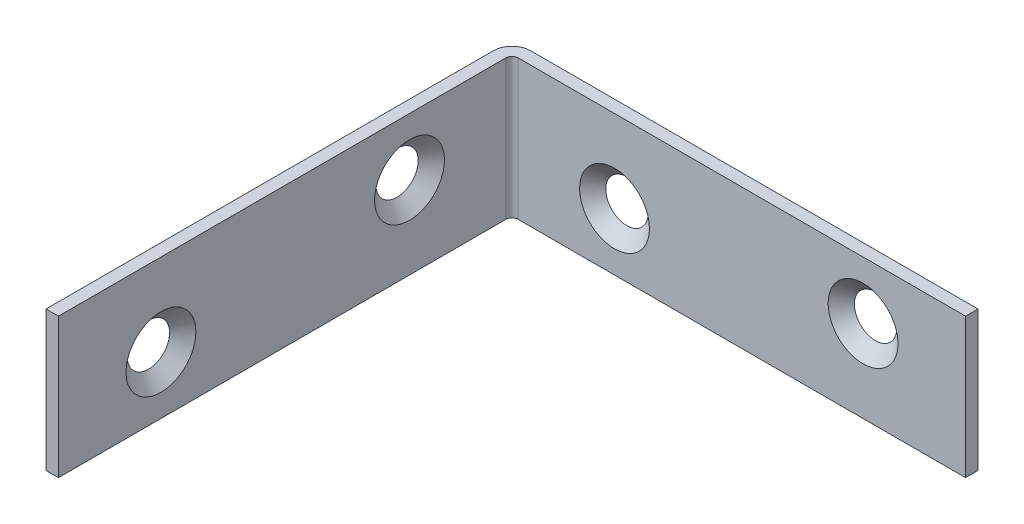
ISO-10303-21;
HEADER;
FILE_DESCRIPTION(('STEP AP214'),'2;1');
FILE_NAME('part.step','',(''),(''),'','','');
FILE_SCHEMA(('AUTOMOTIVE_DESIGN { 1 0 10303 214 1 1 1 1 }'));
ENDSEC;
DATA;
#1=APPLICATION_CONTEXT('core data for automotive mechanical design processes');
#2=APPLICATION_PROTOCOL_DEFINITION('international standard','automotive_design',2000,#1);
#3=PRODUCT_CONTEXT('',#1,'mechanical');
#4=PRODUCT('Part','Part','',(#3));
#5=PRODUCT_RELATED_PRODUCT_CATEGORY('part','',(#4));
#6=PRODUCT_DEFINITION_FORMATION('','',#4);
#7=PRODUCT_DEFINITION_CONTEXT('part definition',#1,'design');
#8=PRODUCT_DEFINITION('design','',#6,#7);
#9=PRODUCT_DEFINITION_SHAPE('','',#8);
#10=(LENGTH_UNIT() NAMED_UNIT(*) SI_UNIT(.MILLI.,.METRE.));
#11=(NAMED_UNIT(*) PLANE_ANGLE_UNIT() SI_UNIT($,.RADIAN.));
#12=(NAMED_UNIT(*) SI_UNIT($,.STERADIAN.) SOLID_ANGLE_UNIT());
#13=UNCERTAINTY_MEASURE_WITH_UNIT(LENGTH_MEASURE(1.E-05),#10,'distance_accuracy_value','');
#14=(GEOMETRIC_REPRESENTATION_CONTEXT(3) GLOBAL_UNCERTAINTY_ASSIGNED_CONTEXT((#13)) GLOBAL_UNIT_ASSIGNED_CONTEXT((#10,
#11,#12)) REPRESENTATION_CONTEXT('',''));
#15=CARTESIAN_POINT('',(0.,0.,0.));
#16=DIRECTION('',(0.,0.,1.));
#17=DIRECTION('',(1.,0.,0.));
#18=AXIS2_PLACEMENT_3D('',#15,#16,#17);
#19=CARTESIAN_POINT('',(2.4003,9.0043,1.6002));
#20=DIRECTION('',(0.,0.,-1.));
#21=DIRECTION('',(-1.,0.,0.));
#22=AXIS2_PLACEMENT_3D('',#19,#20,#21);
#23=PLANE('',#22);
#24=CARTESIAN_POINT('',(46.7975,1.5875,1.6002));
#25=DIRECTION('',(0.,0.,-1.));
#26=DIRECTION('',(-1.,0.,0.));
#27=AXIS2_PLACEMENT_3D('',#24,#25,#26);
#28=CIRCLE('',#27,4.49580000000002);
#29=CARTESIAN_POINT('',(42.3017,1.5875,1.6002));
#30=VERTEX_POINT('',#29);
#31=EDGE_CURVE('E11',#30,#30,#28,.T.);
#32=ORIENTED_EDGE('',*,*,#31,.T.);
#33=EDGE_LOOP('',(#32));
#34=FACE_BOUND('',#33,.T.);
#35=CARTESIAN_POINT('',(14.7975,-1.5875,1.6002));
#36=DIRECTION('',(0.,0.,-1.));
#37=DIRECTION('',(-1.,0.,0.));
#38=AXIS2_PLACEMENT_3D('',#35,#36,#37);
#39=CIRCLE('',#38,4.49580000000001);
#40=CARTESIAN_POINT('',(10.3017,-1.5875,1.6002));
#41=VERTEX_POINT('',#40);
#42=EDGE_CURVE('E41',#41,#41,#39,.T.);
#43=ORIENTED_EDGE('',*,*,#42,.T.);
#44=EDGE_LOOP('',(#43));
#45=FACE_BOUND('',#44,.T.);
#46=DIRECTION('',(1.,0.,0.));
#47=VECTOR('',#46,1.);
#48=CARTESIAN_POINT('',(2.4003,-9.0043,1.6002));
#49=LINE('',#48,#47);
#50=CARTESIAN_POINT('',(2.4003,-9.0043,1.6002));
#51=VERTEX_POINT('',#50);
#52=CARTESIAN_POINT('',(59.9948,-9.0043,1.6002));
#53=VERTEX_POINT('',#52);
#54=EDGE_CURVE('E131',#51,#53,#49,.T.);
#55=ORIENTED_EDGE('',*,*,#54,.T.);
#56=DIRECTION('',(0.,-1.,0.));
#57=VECTOR('',#56,1.);
#58=CARTESIAN_POINT('',(59.9948,9.0043,1.6002));
#59=LINE('',#58,#57);
#60=CARTESIAN_POINT('',(59.9948,9.0043,1.6002));
#61=VERTEX_POINT('',#60);
#62=EDGE_CURVE('E159',#61,#53,#59,.T.);
#63=ORIENTED_EDGE('',*,*,#62,.F.);
#64=DIRECTION('',(1.,0.,0.));
#65=VECTOR('',#64,1.);
#66=CARTESIAN_POINT('',(2.4003,9.0043,1.6002));
#67=LINE('',#66,#65);
#68=CARTESIAN_POINT('',(2.4003,9.0043,1.6002));
#69=VERTEX_POINT('',#68);
#70=EDGE_CURVE('E89',#69,#61,#67,.T.);
#71=ORIENTED_EDGE('',*,*,#70,.F.);
#72=DIRECTION('',(0.,-1.,0.));
#73=VECTOR('',#72,1.);
#74=CARTESIAN_POINT('',(2.4003,9.0043,1.6002));
#75=LINE('',#74,#73);
#76=EDGE_CURVE('E130',#69,#51,#75,.T.);
#77=ORIENTED_EDGE('',*,*,#76,.T.);
#78=EDGE_LOOP('',(#55,#63,#71,#77));
#79=FACE_BOUND('',#78,.T.);
#80=ADVANCED_FACE('F32',(#34,#45,#79),#23,.F.);
#81=CARTESIAN_POINT('',(59.9948,9.0043,0.));
#82=DIRECTION('',(1.,0.,0.));
#83=DIRECTION('',(0.,0.,-1.));
#84=AXIS2_PLACEMENT_3D('',#81,#82,#83);
#85=PLANE('',#84);
#86=DIRECTION('',(0.,0.,1.));
#87=VECTOR('',#86,1.);
#88=CARTESIAN_POINT('',(59.9948,-9.0043,0.));
#89=LINE('',#88,#87);
#90=CARTESIAN_POINT('',(59.9948,-9.0043,0.));
#91=VERTEX_POINT('',#90);
#92=EDGE_CURVE('E134',#91,#53,#89,.T.);
#93=ORIENTED_EDGE('',*,*,#92,.F.);
#94=DIRECTION('',(0.,-1.,0.));
#95=VECTOR('',#94,1.);
#96=CARTESIAN_POINT('',(59.9948,9.0043,0.));
#97=LINE('',#96,#95);
#98=CARTESIAN_POINT('',(59.9948,9.0043,0.));
#99=VERTEX_POINT('',#98);
#100=EDGE_CURVE('E157',#99,#91,#97,.T.);
#101=ORIENTED_EDGE('',*,*,#100,.F.);
#102=DIRECTION('',(0.,0.,1.));
#103=VECTOR('',#102,1.);
#104=CARTESIAN_POINT('',(59.9948,9.0043,0.));
#105=LINE('',#104,#103);
#106=EDGE_CURVE('E196',#99,#61,#105,.T.);
#107=ORIENTED_EDGE('',*,*,#106,.T.);
#108=ORIENTED_EDGE('',*,*,#62,.T.);
#109=EDGE_LOOP('',(#93,#101,#107,#108));
#110=FACE_BOUND('',#109,.T.);
#111=ADVANCED_FACE('F181',(#110),#85,.T.);
#112=CARTESIAN_POINT('',(2.4003,9.0043,0.));
#113=DIRECTION('',(0.,0.,-1.));
#114=DIRECTION('',(-1.,0.,0.));
#115=AXIS2_PLACEMENT_3D('',#112,#113,#114);
#116=PLANE('',#115);
#117=CARTESIAN_POINT('',(46.7975,1.5875,0.));
#118=DIRECTION('',(0.,0.,-1.));
#119=DIRECTION('',(-1.,0.,0.));
#120=AXIS2_PLACEMENT_3D('',#117,#118,#119);
#121=CIRCLE('',#120,2.71859785377036);
#122=CARTESIAN_POINT('',(44.0789021462296,1.5875,0.));
#123=VERTEX_POINT('',#122);
#124=EDGE_CURVE('E164',#123,#123,#121,.F.);
#125=ORIENTED_EDGE('',*,*,#124,.T.);
#126=EDGE_LOOP('',(#125));
#127=FACE_BOUND('',#126,.T.);
#128=CARTESIAN_POINT('',(14.7975,-1.5875,0.));
#129=DIRECTION('',(0.,0.,-1.));
#130=DIRECTION('',(-1.,0.,0.));
#131=AXIS2_PLACEMENT_3D('',#128,#129,#130);
#132=CIRCLE('',#131,2.71859785377036);
#133=CARTESIAN_POINT('',(12.0789021462296,-1.5875,0.));
#134=VERTEX_POINT('',#133);
#135=EDGE_CURVE('E161',#134,#134,#132,.F.);
#136=ORIENTED_EDGE('',*,*,#135,.T.);
#137=EDGE_LOOP('',(#136));
#138=FACE_BOUND('',#137,.T.);
#139=DIRECTION('',(1.,0.,0.));
#140=VECTOR('',#139,1.);
#141=CARTESIAN_POINT('',(2.4003,-9.0043,0.));
#142=LINE('',#141,#140);
#143=CARTESIAN_POINT('',(2.4003,-9.0043,0.));
#144=VERTEX_POINT('',#143);
#145=EDGE_CURVE('E138',#144,#91,#142,.T.);
#146=ORIENTED_EDGE('',*,*,#145,.F.);
#147=DIRECTION('',(0.,-1.,0.));
#148=VECTOR('',#147,1.);
#149=CARTESIAN_POINT('',(2.4003,9.0043,0.));
#150=LINE('',#149,#148);
#151=CARTESIAN_POINT('',(2.4003,9.0043,0.));
#152=VERTEX_POINT('',#151);
#153=EDGE_CURVE('E155',#152,#144,#150,.T.);
#154=ORIENTED_EDGE('',*,*,#153,.F.);
#155=DIRECTION('',(1.,0.,0.));
#156=VECTOR('',#155,1.);
#157=CARTESIAN_POINT('',(2.4003,9.0043,0.));
#158=LINE('',#157,#156);
#159=EDGE_CURVE('E195',#152,#99,#158,.T.);
#160=ORIENTED_EDGE('',*,*,#159,.T.);
#161=ORIENTED_EDGE('',*,*,#100,.T.);
#162=EDGE_LOOP('',(#146,#154,#160,#161));
#163=FACE_BOUND('',#162,.T.);
#164=ADVANCED_FACE('F177',(#127,#138,#163),#116,.T.);
#165=CARTESIAN_POINT('',(2.4003,9.0043,2.4003));
#166=DIRECTION('',(0.,-1.,0.));
#167=DIRECTION('',(0.,0.,-1.));
#168=AXIS2_PLACEMENT_3D('',#165,#166,#167);
#169=CYLINDRICAL_SURFACE('',#168,2.4003);
#170=CARTESIAN_POINT('',(2.4003,-9.0043,2.4003));
#171=DIRECTION('',(0.,-1.,0.));
#172=DIRECTION('',(0.,0.,1.));
#173=AXIS2_PLACEMENT_3D('',#170,#171,#172);
#174=CIRCLE('',#173,2.4003);
#175=CARTESIAN_POINT('',(0.,-9.0043,2.4003));
#176=VERTEX_POINT('',#175);
#177=EDGE_CURVE('E141',#176,#144,#174,.T.);
#178=ORIENTED_EDGE('',*,*,#177,.F.);
#179=DIRECTION('',(0.,-1.,0.));
#180=VECTOR('',#179,1.);
#181=CARTESIAN_POINT('',(0.,9.0043,2.4003));
#182=LINE('',#181,#180);
#183=CARTESIAN_POINT('',(0.,9.0043,2.4003));
#184=VERTEX_POINT('',#183);
#185=EDGE_CURVE('E153',#184,#176,#182,.T.);
#186=ORIENTED_EDGE('',*,*,#185,.F.);
#187=CARTESIAN_POINT('',(2.4003,9.0043,2.4003));
#188=DIRECTION('',(0.,-1.,0.));
#189=DIRECTION('',(0.,0.,1.));
#190=AXIS2_PLACEMENT_3D('',#187,#188,#189);
#191=CIRCLE('',#190,2.4003);
#192=EDGE_CURVE('E125',#184,#152,#191,.T.);
#193=ORIENTED_EDGE('',*,*,#192,.T.);
#194=ORIENTED_EDGE('',*,*,#153,.T.);
#195=EDGE_LOOP('',(#178,#186,#193,#194));
#196=FACE_BOUND('',#195,.T.);
#197=ADVANCED_FACE('F180',(#196),#169,.T.);
#198=CARTESIAN_POINT('',(0.,9.0043,59.9948));
#199=DIRECTION('',(-1.,0.,0.));
#200=DIRECTION('',(0.,0.,1.));
#201=AXIS2_PLACEMENT_3D('',#198,#199,#200);
#202=PLANE('',#201);
#203=CARTESIAN_POINT('',(-1.71453684583156E-13,-1.5875,46.7975));
#204=DIRECTION('',(-1.,0.,0.));
#205=DIRECTION('',(0.,0.,-1.));
#206=AXIS2_PLACEMENT_3D('',#203,#204,#205);
#207=CIRCLE('',#206,2.71859785377036);
#208=CARTESIAN_POINT('',(-1.61493459807713E-13,-1.5875,44.0789021462296));
#209=VERTEX_POINT('',#208);
#210=EDGE_CURVE('E207',#209,#209,#207,.F.);
#211=ORIENTED_EDGE('',*,*,#210,.T.);
#212=EDGE_LOOP('',(#211));
#213=FACE_BOUND('',#212,.T.);
#214=CARTESIAN_POINT('',(0.,1.5875,14.7975));
#215=DIRECTION('',(-1.,0.,0.));
#216=DIRECTION('',(0.,0.,-1.));
#217=AXIS2_PLACEMENT_3D('',#214,#215,#216);
#218=CIRCLE('',#217,2.71859785377036);
#219=CARTESIAN_POINT('',(0.,1.5875,12.0789021462296));
#220=VERTEX_POINT('',#219);
#221=EDGE_CURVE('E135',#220,#220,#218,.F.);
#222=ORIENTED_EDGE('',*,*,#221,.T.);
#223=EDGE_LOOP('',(#222));
#224=FACE_BOUND('',#223,.T.);
#225=DIRECTION('',(0.,0.,-1.));
#226=VECTOR('',#225,1.);
#227=CARTESIAN_POINT('',(0.,-9.0043,59.9948));
#228=LINE('',#227,#226);
#229=CARTESIAN_POINT('',(0.,-9.0043,59.9948));
#230=VERTEX_POINT('',#229);
#231=EDGE_CURVE('E144',#230,#176,#228,.T.);
#232=ORIENTED_EDGE('',*,*,#231,.F.);
#233=DIRECTION('',(0.,-1.,0.));
#234=VECTOR('',#233,1.);
#235=CARTESIAN_POINT('',(0.,9.0043,59.9948));
#236=LINE('',#235,#234);
#237=CARTESIAN_POINT('',(0.,9.0043,59.9948));
#238=VERTEX_POINT('',#237);
#239=EDGE_CURVE('E113',#238,#230,#236,.T.);
#240=ORIENTED_EDGE('',*,*,#239,.F.);
#241=DIRECTION('',(0.,0.,-1.));
#242=VECTOR('',#241,1.);
#243=CARTESIAN_POINT('',(0.,9.0043,59.9948));
#244=LINE('',#243,#242);
#245=EDGE_CURVE('E123',#238,#184,#244,.T.);
#246=ORIENTED_EDGE('',*,*,#245,.T.);
#247=ORIENTED_EDGE('',*,*,#185,.T.);
#248=EDGE_LOOP('',(#232,#240,#246,#247));
#249=FACE_BOUND('',#248,.T.);
#250=ADVANCED_FACE('F222',(#213,#224,#249),#202,.T.);
#251=CARTESIAN_POINT('',(1.6002,9.0043,59.9948));
#252=DIRECTION('',(0.,0.,1.));
#253=DIRECTION('',(1.,0.,0.));
#254=AXIS2_PLACEMENT_3D('',#251,#252,#253);
#255=PLANE('',#254);
#256=DIRECTION('',(-1.,0.,0.));
#257=VECTOR('',#256,1.);
#258=CARTESIAN_POINT('',(1.6002,-9.0043,59.9948));
#259=LINE('',#258,#257);
#260=CARTESIAN_POINT('',(1.6002,-9.0043,59.9948));
#261=VERTEX_POINT('',#260);
#262=EDGE_CURVE('E112',#261,#230,#259,.T.);
#263=ORIENTED_EDGE('',*,*,#262,.F.);
#264=DIRECTION('',(0.,-1.,0.));
#265=VECTOR('',#264,1.);
#266=CARTESIAN_POINT('',(1.6002,9.0043,59.9948));
#267=LINE('',#266,#265);
#268=CARTESIAN_POINT('',(1.6002,9.0043,59.9948));
#269=VERTEX_POINT('',#268);
#270=EDGE_CURVE('E106',#269,#261,#267,.T.);
#271=ORIENTED_EDGE('',*,*,#270,.F.);
#272=DIRECTION('',(-1.,0.,0.));
#273=VECTOR('',#272,1.);
#274=CARTESIAN_POINT('',(1.6002,9.0043,59.9948));
#275=LINE('',#274,#273);
#276=EDGE_CURVE('E110',#269,#238,#275,.T.);
#277=ORIENTED_EDGE('',*,*,#276,.T.);
#278=ORIENTED_EDGE('',*,*,#239,.T.);
#279=EDGE_LOOP('',(#263,#271,#277,#278));
#280=FACE_BOUND('',#279,.T.);
#281=ADVANCED_FACE('F108',(#280),#255,.T.);
#282=CARTESIAN_POINT('',(1.6002,9.0043,59.9948));
#283=DIRECTION('',(-1.,0.,0.));
#284=DIRECTION('',(0.,0.,1.));
#285=AXIS2_PLACEMENT_3D('',#282,#283,#284);
#286=PLANE('',#285);
#287=CARTESIAN_POINT('',(1.60019999999983,-1.5875,46.7975));
#288=DIRECTION('',(-1.,0.,0.));
#289=DIRECTION('',(0.,0.,-1.));
#290=AXIS2_PLACEMENT_3D('',#287,#288,#289);
#291=CIRCLE('',#290,4.49580000000002);
#292=CARTESIAN_POINT('',(1.60019999999984,-1.5875,42.3017));
#293=VERTEX_POINT('',#292);
#294=EDGE_CURVE('E210',#293,#293,#291,.T.);
#295=ORIENTED_EDGE('',*,*,#294,.T.);
#296=EDGE_LOOP('',(#295));
#297=FACE_BOUND('',#296,.T.);
#298=CARTESIAN_POINT('',(1.60019999999995,1.5875,14.7975));
#299=DIRECTION('',(-1.,0.,0.));
#300=DIRECTION('',(0.,0.,-1.));
#301=AXIS2_PLACEMENT_3D('',#298,#299,#300);
#302=CIRCLE('',#301,4.49580000000001);
#303=CARTESIAN_POINT('',(1.60019999999996,1.5875,10.3017));
#304=VERTEX_POINT('',#303);
#305=EDGE_CURVE('E204',#304,#304,#302,.T.);
#306=ORIENTED_EDGE('',*,*,#305,.T.);
#307=EDGE_LOOP('',(#306));
#308=FACE_BOUND('',#307,.T.);
#309=DIRECTION('',(0.,0.,-1.));
#310=VECTOR('',#309,1.);
#311=CARTESIAN_POINT('',(1.6002,-9.0043,59.9948));
#312=LINE('',#311,#310);
#313=CARTESIAN_POINT('',(1.6002,-9.0043,2.4003));
#314=VERTEX_POINT('',#313);
#315=EDGE_CURVE('E77',#261,#314,#312,.T.);
#316=ORIENTED_EDGE('',*,*,#315,.T.);
#317=DIRECTION('',(0.,-1.,0.));
#318=VECTOR('',#317,1.);
#319=CARTESIAN_POINT('',(1.6002,9.0043,2.4003));
#320=LINE('',#319,#318);
#321=CARTESIAN_POINT('',(1.6002,9.0043,2.4003));
#322=VERTEX_POINT('',#321);
#323=EDGE_CURVE('E114',#322,#314,#320,.T.);
#324=ORIENTED_EDGE('',*,*,#323,.F.);
#325=DIRECTION('',(0.,0.,-1.));
#326=VECTOR('',#325,1.);
#327=CARTESIAN_POINT('',(1.6002,9.0043,59.9948));
#328=LINE('',#327,#326);
#329=EDGE_CURVE('E116',#269,#322,#328,.T.);
#330=ORIENTED_EDGE('',*,*,#329,.F.);
#331=ORIENTED_EDGE('',*,*,#270,.T.);
#332=EDGE_LOOP('',(#316,#324,#330,#331));
#333=FACE_BOUND('',#332,.T.);
#334=ADVANCED_FACE('F117',(#297,#308,#333),#286,.F.);
#335=CARTESIAN_POINT('',(2.4003,9.0043,2.4003));
#336=DIRECTION('',(0.,-1.,0.));
#337=DIRECTION('',(0.,0.,-1.));
#338=AXIS2_PLACEMENT_3D('',#335,#336,#337);
#339=CYLINDRICAL_SURFACE('',#338,0.8001);
#340=CARTESIAN_POINT('',(2.4003,-9.0043,2.4003));
#341=DIRECTION('',(0.,1.,0.));
#342=DIRECTION('',(1.,0.,0.));
#343=AXIS2_PLACEMENT_3D('',#340,#341,#342);
#344=CIRCLE('',#343,0.8001);
#345=EDGE_CURVE('E83',#314,#51,#344,.F.);
#346=ORIENTED_EDGE('',*,*,#345,.T.);
#347=ORIENTED_EDGE('',*,*,#76,.F.);
#348=CARTESIAN_POINT('',(2.4003,9.0043,2.4003));
#349=DIRECTION('',(0.,1.,0.));
#350=DIRECTION('',(1.,0.,0.));
#351=AXIS2_PLACEMENT_3D('',#348,#349,#350);
#352=CIRCLE('',#351,0.8001);
#353=EDGE_CURVE('E49',#322,#69,#352,.F.);
#354=ORIENTED_EDGE('',*,*,#353,.F.);
#355=ORIENTED_EDGE('',*,*,#323,.T.);
#356=EDGE_LOOP('',(#346,#347,#354,#355));
#357=FACE_BOUND('',#356,.T.);
#358=ADVANCED_FACE('F228',(#357),#339,.F.);
#359=CARTESIAN_POINT('',(2.4003,9.0043,2.4003));
#360=DIRECTION('',(0.,-1.,0.));
#361=DIRECTION('',(-1.,0.,0.));
#362=AXIS2_PLACEMENT_3D('',#359,#360,#361);
#363=PLANE('',#362);
#364=ORIENTED_EDGE('',*,*,#70,.T.);
#365=ORIENTED_EDGE('',*,*,#106,.F.);
#366=ORIENTED_EDGE('',*,*,#159,.F.);
#367=ORIENTED_EDGE('',*,*,#192,.F.);
#368=ORIENTED_EDGE('',*,*,#245,.F.);
#369=ORIENTED_EDGE('',*,*,#276,.F.);
#370=ORIENTED_EDGE('',*,*,#329,.T.);
#371=ORIENTED_EDGE('',*,*,#353,.T.);
#372=EDGE_LOOP('',(#364,#365,#366,#367,#368,#369,#370,#371));
#373=FACE_BOUND('',#372,.T.);
#374=ADVANCED_FACE('F120',(#373),#363,.F.);
#375=CARTESIAN_POINT('',(2.4003,-9.0043,2.4003));
#376=DIRECTION('',(0.,-1.,0.));
#377=DIRECTION('',(-1.,0.,0.));
#378=AXIS2_PLACEMENT_3D('',#375,#376,#377);
#379=PLANE('',#378);
#380=ORIENTED_EDGE('',*,*,#54,.F.);
#381=ORIENTED_EDGE('',*,*,#345,.F.);
#382=ORIENTED_EDGE('',*,*,#315,.F.);
#383=ORIENTED_EDGE('',*,*,#262,.T.);
#384=ORIENTED_EDGE('',*,*,#231,.T.);
#385=ORIENTED_EDGE('',*,*,#177,.T.);
#386=ORIENTED_EDGE('',*,*,#145,.T.);
#387=ORIENTED_EDGE('',*,*,#92,.T.);
#388=EDGE_LOOP('',(#380,#381,#382,#383,#384,#385,#386,#387));
#389=FACE_BOUND('',#388,.T.);
#390=ADVANCED_FACE('F191',(#389),#379,.T.);
#391=CARTESIAN_POINT('',(46.7975,1.5875,-0.423818251177148));
#392=DIRECTION('',(0.,0.,1.));
#393=DIRECTION('',(1.,0.,0.));
#394=AXIS2_PLACEMENT_3D('',#391,#392,#393);
#395=CONICAL_SURFACE('',#394,2.2479,0.837758040957273);
#396=ORIENTED_EDGE('',*,*,#31,.F.);
#397=EDGE_LOOP('',(#396));
#398=FACE_BOUND('',#397,.T.);
#399=ORIENTED_EDGE('',*,*,#124,.F.);
#400=EDGE_LOOP('',(#399));
#401=FACE_BOUND('',#400,.T.);
#402=ADVANCED_FACE('F174',(#398,#401),#395,.F.);
#403=CARTESIAN_POINT('',(14.7975,-1.5875,-0.423818251177148));
#404=DIRECTION('',(0.,0.,1.));
#405=DIRECTION('',(1.,0.,0.));
#406=AXIS2_PLACEMENT_3D('',#403,#404,#405);
#407=CONICAL_SURFACE('',#406,2.2479,0.837758040957272);
#408=ORIENTED_EDGE('',*,*,#42,.F.);
#409=EDGE_LOOP('',(#408));
#410=FACE_BOUND('',#409,.T.);
#411=ORIENTED_EDGE('',*,*,#135,.F.);
#412=EDGE_LOOP('',(#411));
#413=FACE_BOUND('',#412,.T.);
#414=ADVANCED_FACE('F34',(#410,#413),#407,.F.);
#415=CARTESIAN_POINT('',(-0.423818251177202,1.5875,14.7975));
#416=DIRECTION('',(1.,0.,0.));
#417=DIRECTION('',(0.,0.,1.));
#418=AXIS2_PLACEMENT_3D('',#415,#416,#417);
#419=CONICAL_SURFACE('',#418,2.2479,0.837758040957272);
#420=ORIENTED_EDGE('',*,*,#305,.F.);
#421=EDGE_LOOP('',(#420));
#422=FACE_BOUND('',#421,.T.);
#423=ORIENTED_EDGE('',*,*,#221,.F.);
#424=EDGE_LOOP('',(#423));
#425=FACE_BOUND('',#424,.T.);
#426=ADVANCED_FACE('F173',(#422,#425),#419,.F.);
#427=CARTESIAN_POINT('',(-0.423818251177319,-1.5875,46.7975));
#428=DIRECTION('',(1.,0.,0.));
#429=DIRECTION('',(0.,0.,1.));
#430=AXIS2_PLACEMENT_3D('',#427,#428,#429);
#431=CONICAL_SURFACE('',#430,2.2479,0.837758040957273);
#432=ORIENTED_EDGE('',*,*,#294,.F.);
#433=EDGE_LOOP('',(#432));
#434=FACE_BOUND('',#433,.T.);
#435=ORIENTED_EDGE('',*,*,#210,.F.);
#436=EDGE_LOOP('',(#435));
#437=FACE_BOUND('',#436,.T.);
#438=ADVANCED_FACE('F216',(#434,#437),#431,.F.);
#439=CLOSED_SHELL('',(#80,#111,#164,#197,#250,#281,#334,#358,#374,#390,#402,#414,#426,#438));
#440=MANIFOLD_SOLID_BREP('B2',#439);
#441=ADVANCED_BREP_SHAPE_REPRESENTATION('',(#18,#440),#14);
#442=SHAPE_DEFINITION_REPRESENTATION(#9,#441);
ENDSEC;
END-ISO-10303-21;
